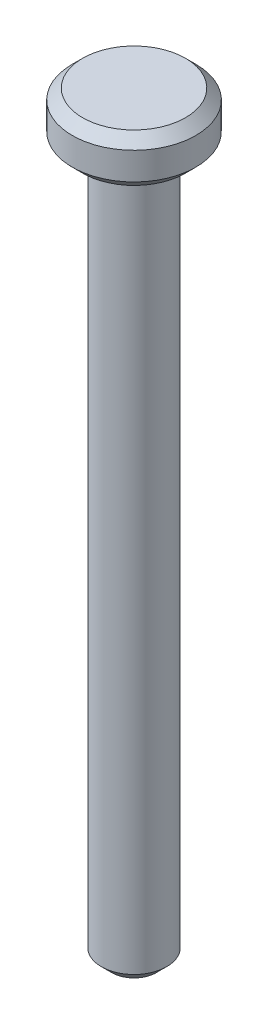
ISO-10303-21;
HEADER;
FILE_DESCRIPTION(('STEP AP214'),'2;1');
FILE_NAME('part.step','',(''),(''),'','','');
FILE_SCHEMA(('AUTOMOTIVE_DESIGN { 1 0 10303 214 1 1 1 1 }'));
ENDSEC;
DATA;
#1=APPLICATION_CONTEXT('core data for automotive mechanical design processes');
#2=APPLICATION_PROTOCOL_DEFINITION('international standard','automotive_design',2000,#1);
#3=PRODUCT_CONTEXT('',#1,'mechanical');
#4=PRODUCT('Part','Part','',(#3));
#5=PRODUCT_RELATED_PRODUCT_CATEGORY('part','',(#4));
#6=PRODUCT_DEFINITION_FORMATION('','',#4);
#7=PRODUCT_DEFINITION_CONTEXT('part definition',#1,'design');
#8=PRODUCT_DEFINITION('design','',#6,#7);
#9=PRODUCT_DEFINITION_SHAPE('','',#8);
#10=(LENGTH_UNIT() NAMED_UNIT(*) SI_UNIT(.MILLI.,.METRE.));
#11=(NAMED_UNIT(*) PLANE_ANGLE_UNIT() SI_UNIT($,.RADIAN.));
#12=(NAMED_UNIT(*) SI_UNIT($,.STERADIAN.) SOLID_ANGLE_UNIT());
#13=UNCERTAINTY_MEASURE_WITH_UNIT(LENGTH_MEASURE(1.E-05),#10,'distance_accuracy_value','');
#14=(GEOMETRIC_REPRESENTATION_CONTEXT(3) GLOBAL_UNCERTAINTY_ASSIGNED_CONTEXT((#13)) GLOBAL_UNIT_ASSIGNED_CONTEXT((#10,
#11,#12)) REPRESENTATION_CONTEXT('',''));
#15=CARTESIAN_POINT('',(0.,0.,0.));
#16=DIRECTION('',(0.,0.,1.));
#17=DIRECTION('',(1.,0.,0.));
#18=AXIS2_PLACEMENT_3D('',#15,#16,#17);
#19=CARTESIAN_POINT('',(0.,110.,0.));
#20=DIRECTION('',(0.,1.,0.));
#21=DIRECTION('',(0.,0.,1.));
#22=AXIS2_PLACEMENT_3D('',#19,#20,#21);
#23=PLANE('',#22);
#24=CARTESIAN_POINT('',(0.,110.,0.));
#25=DIRECTION('',(0.,-1.,0.));
#26=DIRECTION('',(0.,0.,-1.));
#27=AXIS2_PLACEMENT_3D('',#24,#25,#26);
#28=CIRCLE('',#27,7.5);
#29=CARTESIAN_POINT('',(0.,110.,-7.5));
#30=VERTEX_POINT('',#29);
#31=EDGE_CURVE('E10',#30,#30,#28,.T.);
#32=ORIENTED_EDGE('',*,*,#31,.F.);
#33=EDGE_LOOP('',(#32));
#34=FACE_BOUND('',#33,.T.);
#35=ADVANCED_FACE('F37',(#34),#23,.T.);
#36=CARTESIAN_POINT('',(0.,108.5,0.));
#37=DIRECTION('',(0.,-1.,0.));
#38=DIRECTION('',(0.,0.,-1.));
#39=AXIS2_PLACEMENT_3D('',#36,#37,#38);
#40=CONICAL_SURFACE('',#39,9.,0.785398163397447);
#41=ORIENTED_EDGE('',*,*,#31,.T.);
#42=EDGE_LOOP('',(#41));
#43=FACE_BOUND('',#42,.T.);
#44=CARTESIAN_POINT('',(0.,108.5,0.));
#45=DIRECTION('',(0.,-1.,0.));
#46=DIRECTION('',(0.,0.,-1.));
#47=AXIS2_PLACEMENT_3D('',#44,#45,#46);
#48=CIRCLE('',#47,9.);
#49=CARTESIAN_POINT('',(0.,108.5,-9.));
#50=VERTEX_POINT('',#49);
#51=EDGE_CURVE('E43',#50,#50,#48,.T.);
#52=ORIENTED_EDGE('',*,*,#51,.F.);
#53=EDGE_LOOP('',(#52));
#54=FACE_BOUND('',#53,.T.);
#55=ADVANCED_FACE('F85',(#43,#54),#40,.T.);
#56=CARTESIAN_POINT('',(0.,0.,0.));
#57=DIRECTION('',(0.,-1.,0.));
#58=DIRECTION('',(0.,0.,-1.));
#59=AXIS2_PLACEMENT_3D('',#56,#57,#58);
#60=CYLINDRICAL_SURFACE('',#59,9.);
#61=ORIENTED_EDGE('',*,*,#51,.T.);
#62=EDGE_LOOP('',(#61));
#63=FACE_BOUND('',#62,.T.);
#64=CARTESIAN_POINT('',(0.,104.5,0.));
#65=DIRECTION('',(0.,-1.,0.));
#66=DIRECTION('',(0.,0.,-1.));
#67=AXIS2_PLACEMENT_3D('',#64,#65,#66);
#68=CIRCLE('',#67,9.);
#69=CARTESIAN_POINT('',(0.,104.5,-9.));
#70=VERTEX_POINT('',#69);
#71=EDGE_CURVE('E47',#70,#70,#68,.T.);
#72=ORIENTED_EDGE('',*,*,#71,.F.);
#73=EDGE_LOOP('',(#72));
#74=FACE_BOUND('',#73,.T.);
#75=ADVANCED_FACE('F90',(#63,#74),#60,.T.);
#76=CARTESIAN_POINT('',(0.,103.,0.));
#77=DIRECTION('',(0.,1.,0.));
#78=DIRECTION('',(0.,0.,1.));
#79=AXIS2_PLACEMENT_3D('',#76,#77,#78);
#80=CONICAL_SURFACE('',#79,7.5,0.785398163397448);
#81=ORIENTED_EDGE('',*,*,#71,.T.);
#82=EDGE_LOOP('',(#81));
#83=FACE_BOUND('',#82,.T.);
#84=CARTESIAN_POINT('',(0.,103.,0.));
#85=DIRECTION('',(0.,-1.,0.));
#86=DIRECTION('',(0.,0.,-1.));
#87=AXIS2_PLACEMENT_3D('',#84,#85,#86);
#88=CIRCLE('',#87,7.5);
#89=CARTESIAN_POINT('',(0.,103.,-7.5));
#90=VERTEX_POINT('',#89);
#91=EDGE_CURVE('E51',#90,#90,#88,.T.);
#92=ORIENTED_EDGE('',*,*,#91,.F.);
#93=EDGE_LOOP('',(#92));
#94=FACE_BOUND('',#93,.T.);
#95=ADVANCED_FACE('F94',(#83,#94),#80,.T.);
#96=CARTESIAN_POINT('',(0.,103.,-7.5));
#97=DIRECTION('',(0.,-1.,0.));
#98=DIRECTION('',(0.,0.,-1.));
#99=AXIS2_PLACEMENT_3D('',#96,#97,#98);
#100=PLANE('',#99);
#101=ORIENTED_EDGE('',*,*,#91,.T.);
#102=EDGE_LOOP('',(#101));
#103=FACE_BOUND('',#102,.T.);
#104=CARTESIAN_POINT('',(0.,103.,0.));
#105=DIRECTION('',(0.,-1.,0.));
#106=DIRECTION('',(0.,0.,-1.));
#107=AXIS2_PLACEMENT_3D('',#104,#105,#106);
#108=CIRCLE('',#107,6.2625);
#109=CARTESIAN_POINT('',(0.,103.,-6.2625));
#110=VERTEX_POINT('',#109);
#111=EDGE_CURVE('E56',#110,#110,#108,.T.);
#112=ORIENTED_EDGE('',*,*,#111,.F.);
#113=EDGE_LOOP('',(#112));
#114=FACE_BOUND('',#113,.T.);
#115=ADVANCED_FACE('F100',(#103,#114),#100,.T.);
#116=CARTESIAN_POINT('',(0.,101.5,0.));
#117=DIRECTION('',(0.,1.,0.));
#118=DIRECTION('',(0.,0.,1.));
#119=AXIS2_PLACEMENT_3D('',#116,#117,#118);
#120=CONICAL_SURFACE('',#119,4.7625,0.785398163397448);
#121=ORIENTED_EDGE('',*,*,#111,.T.);
#122=EDGE_LOOP('',(#121));
#123=FACE_BOUND('',#122,.T.);
#124=CARTESIAN_POINT('',(0.,101.5,0.));
#125=DIRECTION('',(0.,-1.,0.));
#126=DIRECTION('',(0.,0.,-1.));
#127=AXIS2_PLACEMENT_3D('',#124,#125,#126);
#128=CIRCLE('',#127,4.7625);
#129=CARTESIAN_POINT('',(0.,101.5,-4.7625));
#130=VERTEX_POINT('',#129);
#131=EDGE_CURVE('E59',#130,#130,#128,.T.);
#132=ORIENTED_EDGE('',*,*,#131,.F.);
#133=EDGE_LOOP('',(#132));
#134=FACE_BOUND('',#133,.T.);
#135=ADVANCED_FACE('F81',(#123,#134),#120,.T.);
#136=CARTESIAN_POINT('',(0.,0.,0.));
#137=DIRECTION('',(0.,-1.,0.));
#138=DIRECTION('',(0.,0.,-1.));
#139=AXIS2_PLACEMENT_3D('',#136,#137,#138);
#140=CYLINDRICAL_SURFACE('',#139,4.7625);
#141=ORIENTED_EDGE('',*,*,#131,.T.);
#142=EDGE_LOOP('',(#141));
#143=FACE_BOUND('',#142,.T.);
#144=CARTESIAN_POINT('',(0.,1.5,0.));
#145=DIRECTION('',(0.,-1.,0.));
#146=DIRECTION('',(0.,0.,-1.));
#147=AXIS2_PLACEMENT_3D('',#144,#145,#146);
#148=CIRCLE('',#147,4.7625);
#149=CARTESIAN_POINT('',(0.,1.5,-4.7625));
#150=VERTEX_POINT('',#149);
#151=EDGE_CURVE('E62',#150,#150,#148,.T.);
#152=ORIENTED_EDGE('',*,*,#151,.F.);
#153=EDGE_LOOP('',(#152));
#154=FACE_BOUND('',#153,.T.);
#155=ADVANCED_FACE('F73',(#143,#154),#140,.T.);
#156=CARTESIAN_POINT('',(0.,0.,0.));
#157=DIRECTION('',(0.,1.,0.));
#158=DIRECTION('',(0.,0.,1.));
#159=AXIS2_PLACEMENT_3D('',#156,#157,#158);
#160=CONICAL_SURFACE('',#159,3.2625,0.785398163397448);
#161=ORIENTED_EDGE('',*,*,#151,.T.);
#162=EDGE_LOOP('',(#161));
#163=FACE_BOUND('',#162,.T.);
#164=CARTESIAN_POINT('',(0.,0.,0.));
#165=DIRECTION('',(0.,-1.,0.));
#166=DIRECTION('',(0.,0.,-1.));
#167=AXIS2_PLACEMENT_3D('',#164,#165,#166);
#168=CIRCLE('',#167,3.2625);
#169=CARTESIAN_POINT('',(0.,0.,-3.2625));
#170=VERTEX_POINT('',#169);
#171=EDGE_CURVE('E65',#170,#170,#168,.T.);
#172=ORIENTED_EDGE('',*,*,#171,.F.);
#173=EDGE_LOOP('',(#172));
#174=FACE_BOUND('',#173,.T.);
#175=ADVANCED_FACE('F71',(#163,#174),#160,.T.);
#176=CARTESIAN_POINT('',(0.,0.,0.));
#177=DIRECTION('',(0.,-1.,0.));
#178=DIRECTION('',(0.,0.,-1.));
#179=AXIS2_PLACEMENT_3D('',#176,#177,#178);
#180=PLANE('',#179);
#181=ORIENTED_EDGE('',*,*,#171,.T.);
#182=EDGE_LOOP('',(#181));
#183=FACE_BOUND('',#182,.T.);
#184=ADVANCED_FACE('F69',(#183),#180,.T.);
#185=CLOSED_SHELL('',(#35,#55,#75,#95,#115,#135,#155,#175,#184));
#186=MANIFOLD_SOLID_BREP('B2',#185);
#187=ADVANCED_BREP_SHAPE_REPRESENTATION('',(#18,#186),#14);
#188=SHAPE_DEFINITION_REPRESENTATION(#9,#187);
ENDSEC;
END-ISO-10303-21;
